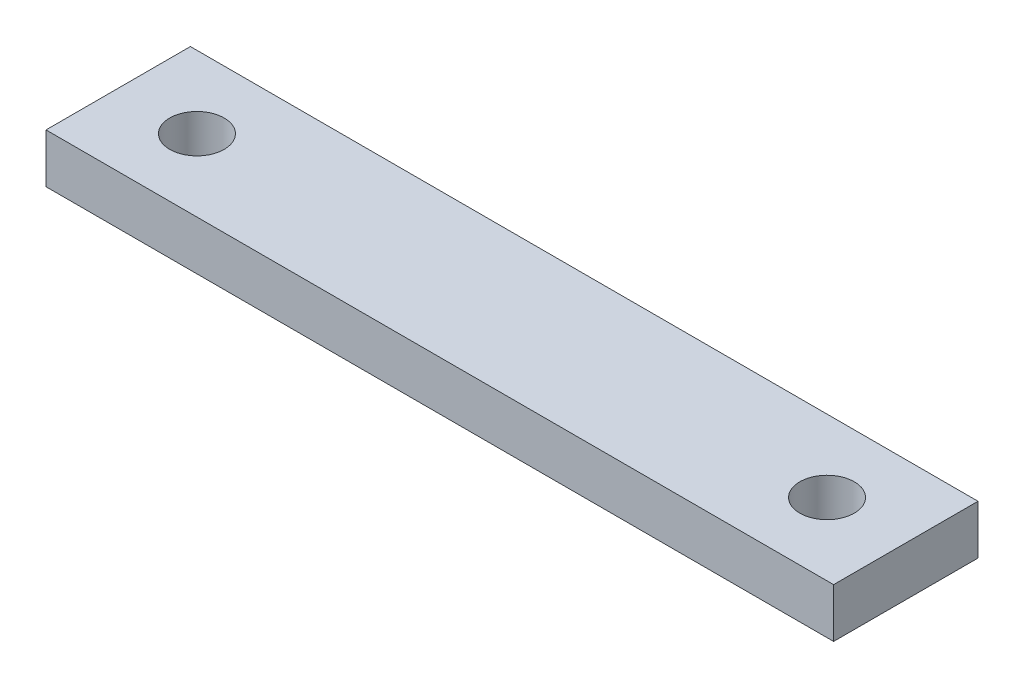
ISO-10303-21;
HEADER;
FILE_DESCRIPTION(('STEP AP214'),'2;1');
FILE_NAME('part.step','',(''),(''),'','','');
FILE_SCHEMA(('AUTOMOTIVE_DESIGN { 1 0 10303 214 1 1 1 1 }'));
ENDSEC;
DATA;
#1=APPLICATION_CONTEXT('core data for automotive mechanical design processes');
#2=APPLICATION_PROTOCOL_DEFINITION('international standard','automotive_design',2000,#1);
#3=PRODUCT_CONTEXT('',#1,'mechanical');
#4=PRODUCT('Part','Part','',(#3));
#5=PRODUCT_RELATED_PRODUCT_CATEGORY('part','',(#4));
#6=PRODUCT_DEFINITION_FORMATION('','',#4);
#7=PRODUCT_DEFINITION_CONTEXT('part definition',#1,'design');
#8=PRODUCT_DEFINITION('design','',#6,#7);
#9=PRODUCT_DEFINITION_SHAPE('','',#8);
#10=(LENGTH_UNIT() NAMED_UNIT(*) SI_UNIT(.MILLI.,.METRE.));
#11=(NAMED_UNIT(*) PLANE_ANGLE_UNIT() SI_UNIT($,.RADIAN.));
#12=(NAMED_UNIT(*) SI_UNIT($,.STERADIAN.) SOLID_ANGLE_UNIT());
#13=UNCERTAINTY_MEASURE_WITH_UNIT(LENGTH_MEASURE(1.E-05),#10,'distance_accuracy_value','');
#14=(GEOMETRIC_REPRESENTATION_CONTEXT(3) GLOBAL_UNCERTAINTY_ASSIGNED_CONTEXT((#13)) GLOBAL_UNIT_ASSIGNED_CONTEXT((#10,
#11,#12)) REPRESENTATION_CONTEXT('',''));
#15=CARTESIAN_POINT('',(0.,0.,0.));
#16=DIRECTION('',(0.,0.,1.));
#17=DIRECTION('',(1.,0.,0.));
#18=AXIS2_PLACEMENT_3D('',#15,#16,#17);
#19=CARTESIAN_POINT('',(0.,15.,44.));
#20=DIRECTION('',(1.,0.,0.));
#21=DIRECTION('',(0.,0.,-1.));
#22=AXIS2_PLACEMENT_3D('',#19,#20,#21);
#23=PLANE('',#22);
#24=DIRECTION('',(0.,-1.,0.));
#25=VECTOR('',#24,1.);
#26=CARTESIAN_POINT('',(0.,15.,0.));
#27=LINE('',#26,#25);
#28=CARTESIAN_POINT('',(0.,15.,0.));
#29=VERTEX_POINT('',#28);
#30=CARTESIAN_POINT('',(0.,0.,0.));
#31=VERTEX_POINT('',#30);
#32=EDGE_CURVE('E102',#29,#31,#27,.T.);
#33=ORIENTED_EDGE('',*,*,#32,.T.);
#34=DIRECTION('',(0.,0.,-1.));
#35=VECTOR('',#34,1.);
#36=CARTESIAN_POINT('',(0.,0.,44.));
#37=LINE('',#36,#35);
#38=CARTESIAN_POINT('',(0.,0.,44.));
#39=VERTEX_POINT('',#38);
#40=EDGE_CURVE('E11',#39,#31,#37,.T.);
#41=ORIENTED_EDGE('',*,*,#40,.F.);
#42=DIRECTION('',(0.,-1.,0.));
#43=VECTOR('',#42,1.);
#44=CARTESIAN_POINT('',(0.,15.,44.));
#45=LINE('',#44,#43);
#46=CARTESIAN_POINT('',(0.,15.,44.));
#47=VERTEX_POINT('',#46);
#48=EDGE_CURVE('E90',#47,#39,#45,.T.);
#49=ORIENTED_EDGE('',*,*,#48,.F.);
#50=DIRECTION('',(0.,0.,-1.));
#51=VECTOR('',#50,1.);
#52=CARTESIAN_POINT('',(0.,15.,44.));
#53=LINE('',#52,#51);
#54=EDGE_CURVE('E98',#47,#29,#53,.T.);
#55=ORIENTED_EDGE('',*,*,#54,.T.);
#56=EDGE_LOOP('',(#33,#41,#49,#55));
#57=FACE_BOUND('',#56,.T.);
#58=ADVANCED_FACE('F39',(#57),#23,.F.);
#59=CARTESIAN_POINT('',(0.,0.,44.));
#60=DIRECTION('',(0.,1.,0.));
#61=DIRECTION('',(0.,0.,1.));
#62=AXIS2_PLACEMENT_3D('',#59,#60,#61);
#63=PLANE('',#62);
#64=CARTESIAN_POINT('',(216.,0.,22.));
#65=DIRECTION('',(0.,1.,0.));
#66=DIRECTION('',(0.,0.,1.));
#67=AXIS2_PLACEMENT_3D('',#64,#65,#66);
#68=CIRCLE('',#67,8.3);
#69=CARTESIAN_POINT('',(216.,0.,30.3));
#70=VERTEX_POINT('',#69);
#71=EDGE_CURVE('E119',#70,#70,#68,.T.);
#72=ORIENTED_EDGE('',*,*,#71,.T.);
#73=EDGE_LOOP('',(#72));
#74=FACE_BOUND('',#73,.T.);
#75=CARTESIAN_POINT('',(24.,0.,22.));
#76=DIRECTION('',(0.,1.,0.));
#77=DIRECTION('',(0.,0.,1.));
#78=AXIS2_PLACEMENT_3D('',#75,#76,#77);
#79=CIRCLE('',#78,8.3);
#80=CARTESIAN_POINT('',(24.,0.,30.3));
#81=VERTEX_POINT('',#80);
#82=EDGE_CURVE('E105',#81,#81,#79,.T.);
#83=ORIENTED_EDGE('',*,*,#82,.T.);
#84=EDGE_LOOP('',(#83));
#85=FACE_BOUND('',#84,.T.);
#86=DIRECTION('',(1.,0.,0.));
#87=VECTOR('',#86,1.);
#88=CARTESIAN_POINT('',(0.,0.,0.));
#89=LINE('',#88,#87);
#90=CARTESIAN_POINT('',(240.,0.,0.));
#91=VERTEX_POINT('',#90);
#92=EDGE_CURVE('E94',#31,#91,#89,.T.);
#93=ORIENTED_EDGE('',*,*,#92,.T.);
#94=DIRECTION('',(0.,0.,-1.));
#95=VECTOR('',#94,1.);
#96=CARTESIAN_POINT('',(240.,0.,44.));
#97=LINE('',#96,#95);
#98=CARTESIAN_POINT('',(240.,0.,44.));
#99=VERTEX_POINT('',#98);
#100=EDGE_CURVE('E47',#99,#91,#97,.T.);
#101=ORIENTED_EDGE('',*,*,#100,.F.);
#102=DIRECTION('',(1.,0.,0.));
#103=VECTOR('',#102,1.);
#104=CARTESIAN_POINT('',(0.,0.,44.));
#105=LINE('',#104,#103);
#106=EDGE_CURVE('E85',#39,#99,#105,.T.);
#107=ORIENTED_EDGE('',*,*,#106,.F.);
#108=ORIENTED_EDGE('',*,*,#40,.T.);
#109=EDGE_LOOP('',(#93,#101,#107,#108));
#110=FACE_BOUND('',#109,.T.);
#111=ADVANCED_FACE('F93',(#74,#85,#110),#63,.F.);
#112=CARTESIAN_POINT('',(240.,0.,44.));
#113=DIRECTION('',(-1.,0.,0.));
#114=DIRECTION('',(0.,0.,1.));
#115=AXIS2_PLACEMENT_3D('',#112,#113,#114);
#116=PLANE('',#115);
#117=DIRECTION('',(0.,1.,0.));
#118=VECTOR('',#117,1.);
#119=CARTESIAN_POINT('',(240.,0.,0.));
#120=LINE('',#119,#118);
#121=CARTESIAN_POINT('',(240.,15.,0.));
#122=VERTEX_POINT('',#121);
#123=EDGE_CURVE('E72',#91,#122,#120,.T.);
#124=ORIENTED_EDGE('',*,*,#123,.T.);
#125=DIRECTION('',(0.,0.,-1.));
#126=VECTOR('',#125,1.);
#127=CARTESIAN_POINT('',(240.,15.,44.));
#128=LINE('',#127,#126);
#129=CARTESIAN_POINT('',(240.,15.,44.));
#130=VERTEX_POINT('',#129);
#131=EDGE_CURVE('E95',#130,#122,#128,.T.);
#132=ORIENTED_EDGE('',*,*,#131,.F.);
#133=DIRECTION('',(0.,1.,0.));
#134=VECTOR('',#133,1.);
#135=CARTESIAN_POINT('',(240.,0.,44.));
#136=LINE('',#135,#134);
#137=EDGE_CURVE('E88',#99,#130,#136,.T.);
#138=ORIENTED_EDGE('',*,*,#137,.F.);
#139=ORIENTED_EDGE('',*,*,#100,.T.);
#140=EDGE_LOOP('',(#124,#132,#138,#139));
#141=FACE_BOUND('',#140,.T.);
#142=ADVANCED_FACE('F96',(#141),#116,.F.);
#143=CARTESIAN_POINT('',(240.,15.,44.));
#144=DIRECTION('',(0.,-1.,0.));
#145=DIRECTION('',(0.,0.,-1.));
#146=AXIS2_PLACEMENT_3D('',#143,#144,#145);
#147=PLANE('',#146);
#148=CARTESIAN_POINT('',(216.,15.,22.));
#149=DIRECTION('',(0.,1.,0.));
#150=DIRECTION('',(0.,0.,1.));
#151=AXIS2_PLACEMENT_3D('',#148,#149,#150);
#152=CIRCLE('',#151,8.3);
#153=CARTESIAN_POINT('',(216.,15.,30.3));
#154=VERTEX_POINT('',#153);
#155=EDGE_CURVE('E122',#154,#154,#152,.T.);
#156=ORIENTED_EDGE('',*,*,#155,.F.);
#157=EDGE_LOOP('',(#156));
#158=FACE_BOUND('',#157,.T.);
#159=CARTESIAN_POINT('',(24.,15.,22.));
#160=DIRECTION('',(0.,1.,0.));
#161=DIRECTION('',(0.,0.,1.));
#162=AXIS2_PLACEMENT_3D('',#159,#160,#161);
#163=CIRCLE('',#162,8.3);
#164=CARTESIAN_POINT('',(24.,15.,30.3));
#165=VERTEX_POINT('',#164);
#166=EDGE_CURVE('E116',#165,#165,#163,.T.);
#167=ORIENTED_EDGE('',*,*,#166,.F.);
#168=EDGE_LOOP('',(#167));
#169=FACE_BOUND('',#168,.T.);
#170=DIRECTION('',(-1.,0.,0.));
#171=VECTOR('',#170,1.);
#172=CARTESIAN_POINT('',(240.,15.,0.));
#173=LINE('',#172,#171);
#174=EDGE_CURVE('E78',#122,#29,#173,.T.);
#175=ORIENTED_EDGE('',*,*,#174,.T.);
#176=ORIENTED_EDGE('',*,*,#54,.F.);
#177=DIRECTION('',(-1.,0.,0.));
#178=VECTOR('',#177,1.);
#179=CARTESIAN_POINT('',(240.,15.,44.));
#180=LINE('',#179,#178);
#181=EDGE_CURVE('E55',#130,#47,#180,.T.);
#182=ORIENTED_EDGE('',*,*,#181,.F.);
#183=ORIENTED_EDGE('',*,*,#131,.T.);
#184=EDGE_LOOP('',(#175,#176,#182,#183));
#185=FACE_BOUND('',#184,.T.);
#186=ADVANCED_FACE('F110',(#158,#169,#185),#147,.F.);
#187=CARTESIAN_POINT('',(0.,0.,44.));
#188=DIRECTION('',(0.,0.,1.));
#189=DIRECTION('',(1.,0.,0.));
#190=AXIS2_PLACEMENT_3D('',#187,#188,#189);
#191=PLANE('',#190);
#192=ORIENTED_EDGE('',*,*,#48,.T.);
#193=ORIENTED_EDGE('',*,*,#106,.T.);
#194=ORIENTED_EDGE('',*,*,#137,.T.);
#195=ORIENTED_EDGE('',*,*,#181,.T.);
#196=EDGE_LOOP('',(#192,#193,#194,#195));
#197=FACE_BOUND('',#196,.T.);
#198=ADVANCED_FACE('F86',(#197),#191,.T.);
#199=CARTESIAN_POINT('',(0.,0.,0.));
#200=DIRECTION('',(0.,0.,1.));
#201=DIRECTION('',(1.,0.,0.));
#202=AXIS2_PLACEMENT_3D('',#199,#200,#201);
#203=PLANE('',#202);
#204=ORIENTED_EDGE('',*,*,#32,.F.);
#205=ORIENTED_EDGE('',*,*,#174,.F.);
#206=ORIENTED_EDGE('',*,*,#123,.F.);
#207=ORIENTED_EDGE('',*,*,#92,.F.);
#208=EDGE_LOOP('',(#204,#205,#206,#207));
#209=FACE_BOUND('',#208,.T.);
#210=ADVANCED_FACE('F113',(#209),#203,.F.);
#211=CARTESIAN_POINT('',(24.,0.,22.));
#212=DIRECTION('',(0.,1.,0.));
#213=DIRECTION('',(0.,0.,1.));
#214=AXIS2_PLACEMENT_3D('',#211,#212,#213);
#215=CYLINDRICAL_SURFACE('',#214,8.3);
#216=ORIENTED_EDGE('',*,*,#82,.F.);
#217=EDGE_LOOP('',(#216));
#218=FACE_BOUND('',#217,.T.);
#219=ORIENTED_EDGE('',*,*,#166,.T.);
#220=EDGE_LOOP('',(#219));
#221=FACE_BOUND('',#220,.T.);
#222=ADVANCED_FACE('F133',(#218,#221),#215,.F.);
#223=CARTESIAN_POINT('',(216.,0.,22.));
#224=DIRECTION('',(0.,1.,0.));
#225=DIRECTION('',(0.,0.,1.));
#226=AXIS2_PLACEMENT_3D('',#223,#224,#225);
#227=CYLINDRICAL_SURFACE('',#226,8.3);
#228=ORIENTED_EDGE('',*,*,#71,.F.);
#229=EDGE_LOOP('',(#228));
#230=FACE_BOUND('',#229,.T.);
#231=ORIENTED_EDGE('',*,*,#155,.T.);
#232=EDGE_LOOP('',(#231));
#233=FACE_BOUND('',#232,.T.);
#234=ADVANCED_FACE('F130',(#230,#233),#227,.F.);
#235=CLOSED_SHELL('',(#58,#111,#142,#186,#198,#210,#222,#234));
#236=MANIFOLD_SOLID_BREP('B2',#235);
#237=ADVANCED_BREP_SHAPE_REPRESENTATION('',(#18,#236),#14);
#238=SHAPE_DEFINITION_REPRESENTATION(#9,#237);
ENDSEC;
END-ISO-10303-21;
